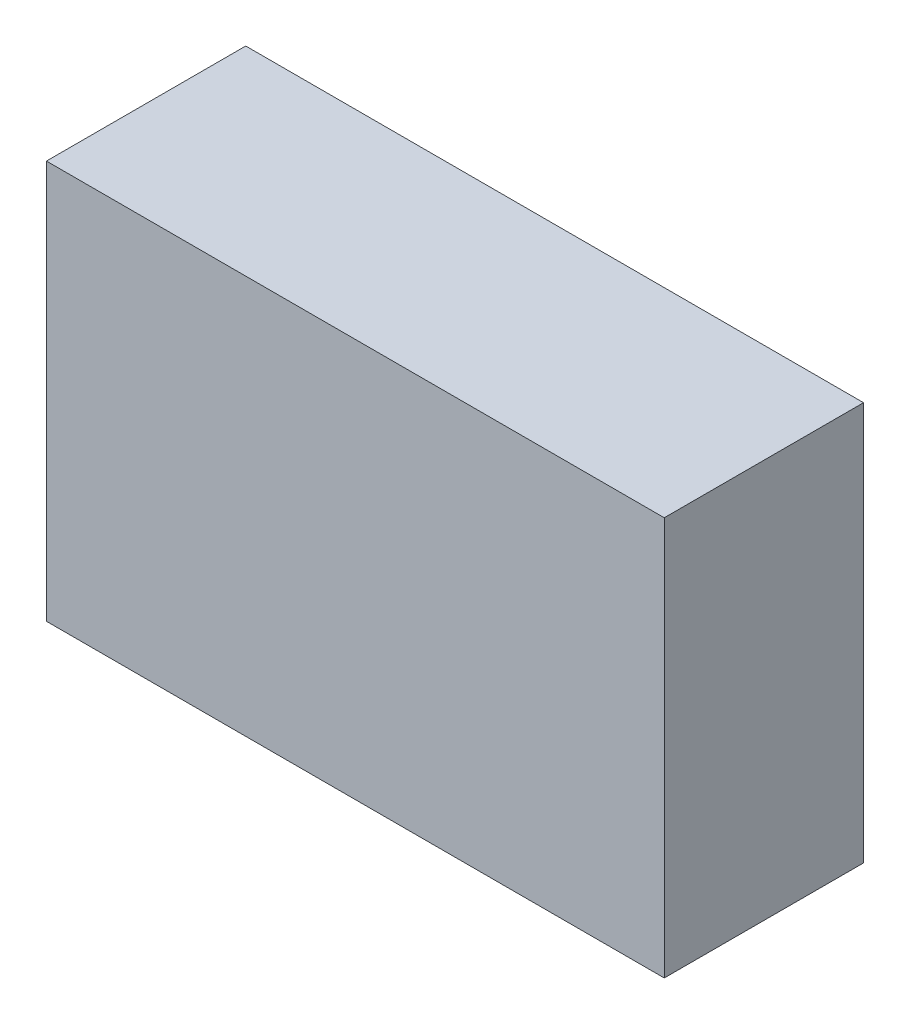
ISO-10303-21;
HEADER;
FILE_DESCRIPTION(('STEP AP214'),'2;1');
FILE_NAME('part.step','',(''),(''),'','','');
FILE_SCHEMA(('AUTOMOTIVE_DESIGN { 1 0 10303 214 1 1 1 1 }'));
ENDSEC;
DATA;
#1=APPLICATION_CONTEXT('core data for automotive mechanical design processes');
#2=APPLICATION_PROTOCOL_DEFINITION('international standard','automotive_design',2000,#1);
#3=PRODUCT_CONTEXT('',#1,'mechanical');
#4=PRODUCT('Part','Part','',(#3));
#5=PRODUCT_RELATED_PRODUCT_CATEGORY('part','',(#4));
#6=PRODUCT_DEFINITION_FORMATION('','',#4);
#7=PRODUCT_DEFINITION_CONTEXT('part definition',#1,'design');
#8=PRODUCT_DEFINITION('design','',#6,#7);
#9=PRODUCT_DEFINITION_SHAPE('','',#8);
#10=(LENGTH_UNIT() NAMED_UNIT(*) SI_UNIT(.MILLI.,.METRE.));
#11=(NAMED_UNIT(*) PLANE_ANGLE_UNIT() SI_UNIT($,.RADIAN.));
#12=(NAMED_UNIT(*) SI_UNIT($,.STERADIAN.) SOLID_ANGLE_UNIT());
#13=UNCERTAINTY_MEASURE_WITH_UNIT(LENGTH_MEASURE(1.E-05),#10,'distance_accuracy_value','');
#14=(GEOMETRIC_REPRESENTATION_CONTEXT(3) GLOBAL_UNCERTAINTY_ASSIGNED_CONTEXT((#13)) GLOBAL_UNIT_ASSIGNED_CONTEXT((#10,
#11,#12)) REPRESENTATION_CONTEXT('',''));
#15=CARTESIAN_POINT('',(0.,0.,0.));
#16=DIRECTION('',(0.,0.,1.));
#17=DIRECTION('',(1.,0.,0.));
#18=AXIS2_PLACEMENT_3D('',#15,#16,#17);
#19=CARTESIAN_POINT('',(0.,0.,10.));
#20=DIRECTION('',(1.,0.,0.));
#21=DIRECTION('',(0.,0.,-1.));
#22=AXIS2_PLACEMENT_3D('',#19,#20,#21);
#23=PLANE('',#22);
#24=DIRECTION('',(0.,-1.,0.));
#25=VECTOR('',#24,1.);
#26=CARTESIAN_POINT('',(0.,0.,0.));
#27=LINE('',#26,#25);
#28=CARTESIAN_POINT('',(0.,20.,0.));
#29=VERTEX_POINT('',#28);
#30=CARTESIAN_POINT('',(0.,0.,0.));
#31=VERTEX_POINT('',#30);
#32=EDGE_CURVE('E106',#29,#31,#27,.T.);
#33=ORIENTED_EDGE('',*,*,#32,.T.);
#34=DIRECTION('',(0.,0.,-1.));
#35=VECTOR('',#34,1.);
#36=CARTESIAN_POINT('',(0.,0.,10.));
#37=LINE('',#36,#35);
#38=CARTESIAN_POINT('',(0.,0.,10.));
#39=VERTEX_POINT('',#38);
#40=EDGE_CURVE('E11',#39,#31,#37,.T.);
#41=ORIENTED_EDGE('',*,*,#40,.F.);
#42=DIRECTION('',(0.,-1.,0.));
#43=VECTOR('',#42,1.);
#44=CARTESIAN_POINT('',(0.,0.,10.));
#45=LINE('',#44,#43);
#46=CARTESIAN_POINT('',(0.,20.,10.));
#47=VERTEX_POINT('',#46);
#48=EDGE_CURVE('E92',#47,#39,#45,.T.);
#49=ORIENTED_EDGE('',*,*,#48,.F.);
#50=DIRECTION('',(0.,0.,-1.));
#51=VECTOR('',#50,1.);
#52=CARTESIAN_POINT('',(0.,20.,10.));
#53=LINE('',#52,#51);
#54=EDGE_CURVE('E105',#47,#29,#53,.T.);
#55=ORIENTED_EDGE('',*,*,#54,.T.);
#56=EDGE_LOOP('',(#33,#41,#49,#55));
#57=FACE_BOUND('',#56,.T.);
#58=ADVANCED_FACE('F43',(#57),#23,.F.);
#59=CARTESIAN_POINT('',(0.,0.,10.));
#60=DIRECTION('',(0.,1.,0.));
#61=DIRECTION('',(0.,0.,1.));
#62=AXIS2_PLACEMENT_3D('',#59,#60,#61);
#63=PLANE('',#62);
#64=DIRECTION('',(1.,0.,0.));
#65=VECTOR('',#64,1.);
#66=CARTESIAN_POINT('',(0.,0.,0.));
#67=LINE('',#66,#65);
#68=CARTESIAN_POINT('',(31.,0.,0.));
#69=VERTEX_POINT('',#68);
#70=EDGE_CURVE('E97',#31,#69,#67,.T.);
#71=ORIENTED_EDGE('',*,*,#70,.T.);
#72=DIRECTION('',(0.,0.,-1.));
#73=VECTOR('',#72,1.);
#74=CARTESIAN_POINT('',(31.,0.,10.));
#75=LINE('',#74,#73);
#76=CARTESIAN_POINT('',(31.,0.,10.));
#77=VERTEX_POINT('',#76);
#78=EDGE_CURVE('E51',#77,#69,#75,.T.);
#79=ORIENTED_EDGE('',*,*,#78,.F.);
#80=DIRECTION('',(1.,0.,0.));
#81=VECTOR('',#80,1.);
#82=CARTESIAN_POINT('',(0.,0.,10.));
#83=LINE('',#82,#81);
#84=EDGE_CURVE('E87',#39,#77,#83,.T.);
#85=ORIENTED_EDGE('',*,*,#84,.F.);
#86=ORIENTED_EDGE('',*,*,#40,.T.);
#87=EDGE_LOOP('',(#71,#79,#85,#86));
#88=FACE_BOUND('',#87,.T.);
#89=ADVANCED_FACE('F100',(#88),#63,.F.);
#90=CARTESIAN_POINT('',(31.,0.,10.));
#91=DIRECTION('',(-1.,0.,0.));
#92=DIRECTION('',(0.,0.,1.));
#93=AXIS2_PLACEMENT_3D('',#90,#91,#92);
#94=PLANE('',#93);
#95=DIRECTION('',(0.,1.,0.));
#96=VECTOR('',#95,1.);
#97=CARTESIAN_POINT('',(31.,0.,0.));
#98=LINE('',#97,#96);
#99=CARTESIAN_POINT('',(31.,20.,0.));
#100=VERTEX_POINT('',#99);
#101=EDGE_CURVE('E78',#69,#100,#98,.T.);
#102=ORIENTED_EDGE('',*,*,#101,.T.);
#103=DIRECTION('',(0.,0.,-1.));
#104=VECTOR('',#103,1.);
#105=CARTESIAN_POINT('',(31.,20.,10.));
#106=LINE('',#105,#104);
#107=CARTESIAN_POINT('',(31.,20.,10.));
#108=VERTEX_POINT('',#107);
#109=EDGE_CURVE('E98',#108,#100,#106,.T.);
#110=ORIENTED_EDGE('',*,*,#109,.F.);
#111=DIRECTION('',(0.,1.,0.));
#112=VECTOR('',#111,1.);
#113=CARTESIAN_POINT('',(31.,0.,10.));
#114=LINE('',#113,#112);
#115=EDGE_CURVE('E95',#77,#108,#114,.T.);
#116=ORIENTED_EDGE('',*,*,#115,.F.);
#117=ORIENTED_EDGE('',*,*,#78,.T.);
#118=EDGE_LOOP('',(#102,#110,#116,#117));
#119=FACE_BOUND('',#118,.T.);
#120=ADVANCED_FACE('F99',(#119),#94,.F.);
#121=CARTESIAN_POINT('',(0.,20.,10.));
#122=DIRECTION('',(0.,-1.,0.));
#123=DIRECTION('',(0.,0.,-1.));
#124=AXIS2_PLACEMENT_3D('',#121,#122,#123);
#125=PLANE('',#124);
#126=DIRECTION('',(-1.,0.,0.));
#127=VECTOR('',#126,1.);
#128=CARTESIAN_POINT('',(0.,20.,0.));
#129=LINE('',#128,#127);
#130=EDGE_CURVE('E85',#100,#29,#129,.T.);
#131=ORIENTED_EDGE('',*,*,#130,.T.);
#132=ORIENTED_EDGE('',*,*,#54,.F.);
#133=DIRECTION('',(-1.,0.,0.));
#134=VECTOR('',#133,1.);
#135=CARTESIAN_POINT('',(0.,20.,10.));
#136=LINE('',#135,#134);
#137=EDGE_CURVE('E56',#108,#47,#136,.T.);
#138=ORIENTED_EDGE('',*,*,#137,.F.);
#139=ORIENTED_EDGE('',*,*,#109,.T.);
#140=EDGE_LOOP('',(#131,#132,#138,#139));
#141=FACE_BOUND('',#140,.T.);
#142=ADVANCED_FACE('F111',(#141),#125,.F.);
#143=CARTESIAN_POINT('',(0.,0.,10.));
#144=DIRECTION('',(0.,0.,-1.));
#145=DIRECTION('',(-1.,0.,0.));
#146=AXIS2_PLACEMENT_3D('',#143,#144,#145);
#147=PLANE('',#146);
#148=ORIENTED_EDGE('',*,*,#48,.T.);
#149=ORIENTED_EDGE('',*,*,#84,.T.);
#150=ORIENTED_EDGE('',*,*,#115,.T.);
#151=ORIENTED_EDGE('',*,*,#137,.T.);
#152=EDGE_LOOP('',(#148,#149,#150,#151));
#153=FACE_BOUND('',#152,.T.);
#154=ADVANCED_FACE('F89',(#153),#147,.F.);
#155=CARTESIAN_POINT('',(0.,0.,0.));
#156=DIRECTION('',(0.,0.,-1.));
#157=DIRECTION('',(-1.,0.,0.));
#158=AXIS2_PLACEMENT_3D('',#155,#156,#157);
#159=PLANE('',#158);
#160=ORIENTED_EDGE('',*,*,#32,.F.);
#161=ORIENTED_EDGE('',*,*,#130,.F.);
#162=ORIENTED_EDGE('',*,*,#101,.F.);
#163=ORIENTED_EDGE('',*,*,#70,.F.);
#164=EDGE_LOOP('',(#160,#161,#162,#163));
#165=FACE_BOUND('',#164,.T.);
#166=ADVANCED_FACE('F116',(#165),#159,.T.);
#167=CLOSED_SHELL('',(#58,#89,#120,#142,#154,#166));
#168=MANIFOLD_SOLID_BREP('B2',#167);
#169=ADVANCED_BREP_SHAPE_REPRESENTATION('',(#18,#168),#14);
#170=SHAPE_DEFINITION_REPRESENTATION(#9,#169);
ENDSEC;
END-ISO-10303-21;
